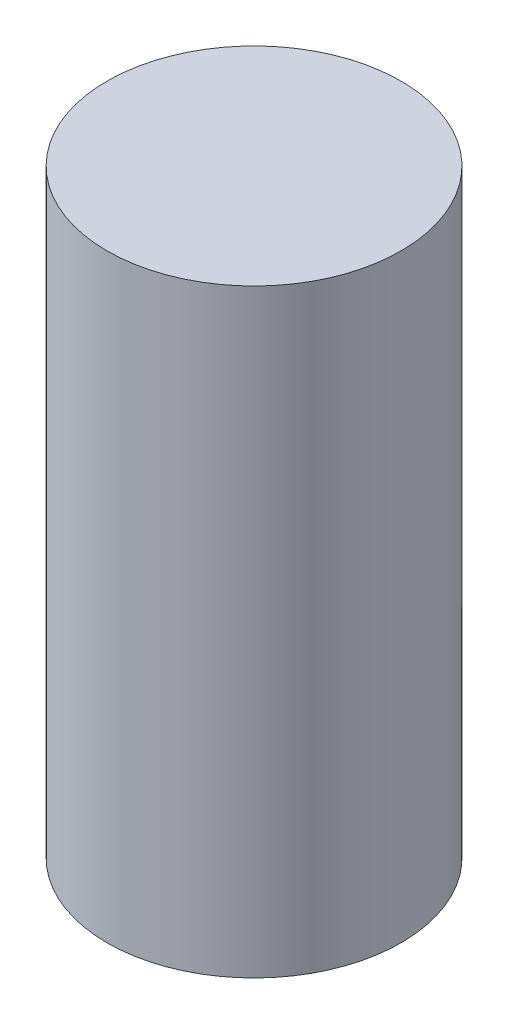
ISO-10303-21;
HEADER;
FILE_DESCRIPTION(('STEP AP214'),'2;1');
FILE_NAME('part.step','',(''),(''),'','','');
FILE_SCHEMA(('AUTOMOTIVE_DESIGN { 1 0 10303 214 1 1 1 1 }'));
ENDSEC;
DATA;
#1=APPLICATION_CONTEXT('core data for automotive mechanical design processes');
#2=APPLICATION_PROTOCOL_DEFINITION('international standard','automotive_design',2000,#1);
#3=PRODUCT_CONTEXT('',#1,'mechanical');
#4=PRODUCT('Part','Part','',(#3));
#5=PRODUCT_RELATED_PRODUCT_CATEGORY('part','',(#4));
#6=PRODUCT_DEFINITION_FORMATION('','',#4);
#7=PRODUCT_DEFINITION_CONTEXT('part definition',#1,'design');
#8=PRODUCT_DEFINITION('design','',#6,#7);
#9=PRODUCT_DEFINITION_SHAPE('','',#8);
#10=(LENGTH_UNIT() NAMED_UNIT(*) SI_UNIT(.MILLI.,.METRE.));
#11=(NAMED_UNIT(*) PLANE_ANGLE_UNIT() SI_UNIT($,.RADIAN.));
#12=(NAMED_UNIT(*) SI_UNIT($,.STERADIAN.) SOLID_ANGLE_UNIT());
#13=UNCERTAINTY_MEASURE_WITH_UNIT(LENGTH_MEASURE(1.E-05),#10,'distance_accuracy_value','');
#14=(GEOMETRIC_REPRESENTATION_CONTEXT(3) GLOBAL_UNCERTAINTY_ASSIGNED_CONTEXT((#13)) GLOBAL_UNIT_ASSIGNED_CONTEXT((#10,
#11,#12)) REPRESENTATION_CONTEXT('',''));
#15=CARTESIAN_POINT('',(0.,0.,0.));
#16=DIRECTION('',(0.,0.,1.));
#17=DIRECTION('',(1.,0.,0.));
#18=AXIS2_PLACEMENT_3D('',#15,#16,#17);
#19=CARTESIAN_POINT('',(0.,300.,0.));
#20=DIRECTION('',(0.,-1.,0.));
#21=DIRECTION('',(0.,0.,-1.));
#22=AXIS2_PLACEMENT_3D('',#19,#20,#21);
#23=CYLINDRICAL_SURFACE('',#22,73.61);
#24=CARTESIAN_POINT('',(0.,300.,0.));
#25=DIRECTION('',(0.,1.,0.));
#26=DIRECTION('',(0.,0.,1.));
#27=AXIS2_PLACEMENT_3D('',#24,#25,#26);
#28=CIRCLE('',#27,73.61);
#29=CARTESIAN_POINT('',(0.,300.,73.61));
#30=VERTEX_POINT('',#29);
#31=EDGE_CURVE('E10',#30,#30,#28,.T.);
#32=ORIENTED_EDGE('',*,*,#31,.F.);
#33=EDGE_LOOP('',(#32));
#34=FACE_BOUND('',#33,.T.);
#35=CARTESIAN_POINT('',(0.,0.,0.));
#36=DIRECTION('',(0.,1.,0.));
#37=DIRECTION('',(0.,0.,1.));
#38=AXIS2_PLACEMENT_3D('',#35,#36,#37);
#39=CIRCLE('',#38,73.61);
#40=CARTESIAN_POINT('',(0.,0.,73.61));
#41=VERTEX_POINT('',#40);
#42=EDGE_CURVE('E35',#41,#41,#39,.T.);
#43=ORIENTED_EDGE('',*,*,#42,.T.);
#44=EDGE_LOOP('',(#43));
#45=FACE_BOUND('',#44,.T.);
#46=ADVANCED_FACE('F32',(#34,#45),#23,.T.);
#47=CARTESIAN_POINT('',(0.,300.,0.));
#48=DIRECTION('',(0.,1.,0.));
#49=DIRECTION('',(0.,0.,1.));
#50=AXIS2_PLACEMENT_3D('',#47,#48,#49);
#51=PLANE('',#50);
#52=ORIENTED_EDGE('',*,*,#31,.T.);
#53=EDGE_LOOP('',(#52));
#54=FACE_BOUND('',#53,.T.);
#55=ADVANCED_FACE('F47',(#54),#51,.T.);
#56=CARTESIAN_POINT('',(0.,0.,0.));
#57=DIRECTION('',(0.,1.,0.));
#58=DIRECTION('',(0.,0.,1.));
#59=AXIS2_PLACEMENT_3D('',#56,#57,#58);
#60=PLANE('',#59);
#61=ORIENTED_EDGE('',*,*,#42,.F.);
#62=EDGE_LOOP('',(#61));
#63=FACE_BOUND('',#62,.T.);
#64=ADVANCED_FACE('F45',(#63),#60,.F.);
#65=CLOSED_SHELL('',(#46,#55,#64));
#66=MANIFOLD_SOLID_BREP('B2',#65);
#67=ADVANCED_BREP_SHAPE_REPRESENTATION('',(#18,#66),#14);
#68=SHAPE_DEFINITION_REPRESENTATION(#9,#67);
ENDSEC;
END-ISO-10303-21;
